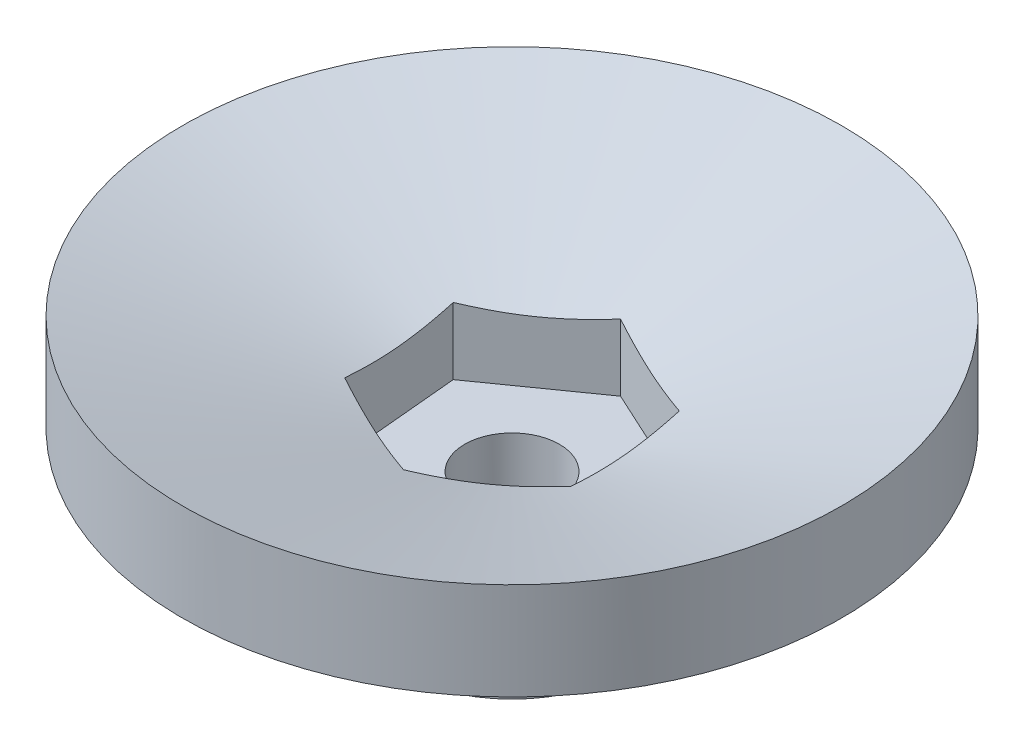
ISO-10303-21;
HEADER;
FILE_DESCRIPTION(('STEP AP214'),'2;1');
FILE_NAME('part.step','',(''),(''),'','','');
FILE_SCHEMA(('AUTOMOTIVE_DESIGN { 1 0 10303 214 1 1 1 1 }'));
ENDSEC;
DATA;
#1=APPLICATION_CONTEXT('core data for automotive mechanical design processes');
#2=APPLICATION_PROTOCOL_DEFINITION('international standard','automotive_design',2000,#1);
#3=PRODUCT_CONTEXT('',#1,'mechanical');
#4=PRODUCT('Part','Part','',(#3));
#5=PRODUCT_RELATED_PRODUCT_CATEGORY('part','',(#4));
#6=PRODUCT_DEFINITION_FORMATION('','',#4);
#7=PRODUCT_DEFINITION_CONTEXT('part definition',#1,'design');
#8=PRODUCT_DEFINITION('design','',#6,#7);
#9=PRODUCT_DEFINITION_SHAPE('','',#8);
#10=(LENGTH_UNIT() NAMED_UNIT(*) SI_UNIT(.MILLI.,.METRE.));
#11=(NAMED_UNIT(*) PLANE_ANGLE_UNIT() SI_UNIT($,.RADIAN.));
#12=(NAMED_UNIT(*) SI_UNIT($,.STERADIAN.) SOLID_ANGLE_UNIT());
#13=UNCERTAINTY_MEASURE_WITH_UNIT(LENGTH_MEASURE(1.E-05),#10,'distance_accuracy_value','');
#14=(GEOMETRIC_REPRESENTATION_CONTEXT(3) GLOBAL_UNCERTAINTY_ASSIGNED_CONTEXT((#13)) GLOBAL_UNIT_ASSIGNED_CONTEXT((#10,
#11,#12)) REPRESENTATION_CONTEXT('',''));
#15=CARTESIAN_POINT('',(0.,0.,0.));
#16=DIRECTION('',(0.,0.,1.));
#17=DIRECTION('',(1.,0.,0.));
#18=AXIS2_PLACEMENT_3D('',#15,#16,#17);
#19=CARTESIAN_POINT('',(0.,17.6822076251545,0.));
#20=DIRECTION('',(0.,1.,0.));
#21=DIRECTION('',(0.,0.,1.));
#22=AXIS2_PLACEMENT_3D('',#19,#20,#21);
#23=CONICAL_SURFACE('',#22,28.5316954888546,1.25663706143592);
#24=CARTESIAN_POINT('',(0.,17.6822076251545,0.));
#25=DIRECTION('',(0.,-1.,0.));
#26=DIRECTION('',(0.,0.,-1.));
#27=AXIS2_PLACEMENT_3D('',#24,#25,#26);
#28=CIRCLE('',#27,28.5316954888546);
#29=CARTESIAN_POINT('',(0.,17.6822076251545,-28.5316954888546));
#30=VERTEX_POINT('',#29);
#31=EDGE_CURVE('E166',#30,#30,#28,.T.);
#32=ORIENTED_EDGE('',*,*,#31,.F.);
#33=EDGE_LOOP('',(#32));
#34=FACE_BOUND('',#33,.T.);
#35=CARTESIAN_POINT('',(9.43870022979649,11.7884021206192,4.34896349665437));
#36=CARTESIAN_POINT('',(9.08684127379955,11.7183683143036,4.59772980691083));
#37=CARTESIAN_POINT('',(8.73405174222567,11.6547172852872,4.84715403946468));
#38=CARTESIAN_POINT('',(8.02664290125282,11.5428019900332,5.34729616804288));
#39=CARTESIAN_POINT('',(7.67202260640352,11.4945471395818,5.59801476078629));
#40=CARTESIAN_POINT('',(6.96409961171872,11.4164337596209,6.09852039900279));
#41=CARTESIAN_POINT('',(6.61080721579867,11.3864389245007,6.34830015954827));
#42=CARTESIAN_POINT('',(5.9035622341988,11.3462124651001,6.84832643860517));
#43=CARTESIAN_POINT('',(5.54960987196697,11.3359750600022,7.09857279913758));
#44=CARTESIAN_POINT('',(4.84170514750331,11.3359750600022,7.59906552020241));
#45=CARTESIAN_POINT('',(4.48775278527148,11.3462124651001,7.84931188073483));
#46=CARTESIAN_POINT('',(3.78050780367161,11.3864389245007,8.34933815979173));
#47=CARTESIAN_POINT('',(3.42721540775155,11.4164337596209,8.5991179203372));
#48=CARTESIAN_POINT('',(2.71929241306675,11.4945471395818,9.0996235585537));
#49=CARTESIAN_POINT('',(2.36467211821745,11.5428019900332,9.35034215129711));
#50=CARTESIAN_POINT('',(1.6572632772446,11.6547172852872,9.85048427987531));
#51=CARTESIAN_POINT('',(1.30447374567073,11.7183683143036,10.0999085124292));
#52=CARTESIAN_POINT('',(0.952614789673784,11.7884021206192,10.3486748226856));
#53=B_SPLINE_CURVE_WITH_KNOTS('',3,(#35,#36,#37,#38,#39,#40,#41,#42,#43,#44,#45,#46,#47,#48,#49,
#50,#51,#52),.UNSPECIFIED.,.F.,.F.,(4,2,2,2,2,2,2,2,4),(0.,1.30981735837269,2.62043422845874,
3.92114377250665,5.221472684806,6.52180159710535,7.82251114115326,9.13312801123931,
10.442945369612),.UNSPECIFIED.);
#54=CARTESIAN_POINT('',(9.43850022979649,11.7883623274375,4.34910489780731));
#55=VERTEX_POINT('',#54);
#56=CARTESIAN_POINT('',(0.952814789673786,11.7883623274375,10.3485334215327));
#57=VERTEX_POINT('',#56);
#58=EDGE_CURVE('E225',#55,#57,#53,.T.);
#59=ORIENTED_EDGE('',*,*,#58,.T.);
#60=CARTESIAN_POINT('',(0.953014789673786,11.7883981034413,10.3486255782269));
#61=CARTESIAN_POINT('',(0.561649218084829,11.7183648772961,10.1682907916834));
#62=CARTESIAN_POINT('',(0.169248591367872,11.6547143940683,9.98747906884534));
#63=CARTESIAN_POINT('',(-0.617587871380383,11.5428000810022,9.62491783235686));
#64=CARTESIAN_POINT('',(-1.01202480348306,11.4945456667279,9.44316781365491));
#65=CARTESIAN_POINT('',(-1.79943314576685,11.41643300162,9.080343064529));
#66=CARTESIAN_POINT('',(-2.19239309530084,11.3864384474423,8.8992736149818));
#67=CARTESIAN_POINT('',(-2.97904730398483,11.3462123669672,8.53679635815367));
#68=CARTESIAN_POINT('',(-3.37274131460464,11.3359750600023,8.35538866539135));
#69=CARTESIAN_POINT('',(-4.16012933584428,11.3359750600023,7.9925732798667));
#70=CARTESIAN_POINT('',(-4.55382334646409,11.3462123669672,7.81116558710438));
#71=CARTESIAN_POINT('',(-5.34047755514808,11.3864384474423,7.44868833027625));
#72=CARTESIAN_POINT('',(-5.73343750468207,11.41643300162,7.26761888072905));
#73=CARTESIAN_POINT('',(-6.52084584696586,11.4945456667279,6.90479413160314));
#74=CARTESIAN_POINT('',(-6.91528277906854,11.5428000810022,6.72304411290119));
#75=CARTESIAN_POINT('',(-7.70211924181679,11.6547143940683,6.36048287641271));
#76=CARTESIAN_POINT('',(-8.09451986853375,11.7183648772961,6.1796711535746));
#77=CARTESIAN_POINT('',(-8.48588544012271,11.7883981034413,5.99933636703115));
#78=B_SPLINE_CURVE_WITH_KNOTS('',3,(#60,#61,#62,#63,#64,#65,#66,#67,#68,#69,#70,#71,#72,#73,#74,
#75,#76,#77),.UNSPECIFIED.,.F.,.F.,(4,2,2,2,2,2,2,2,4),(0.,1.30981104274094,2.62042158020904,
3.92112492117652,5.22144763856673,6.52177035595694,7.82247369692442,9.13308423439252,
10.4428952771335),.UNSPECIFIED.);
#79=CARTESIAN_POINT('',(-8.4856854401227,11.7883623274375,5.99942852372537));
#80=VERTEX_POINT('',#79);
#81=EDGE_CURVE('E11',#57,#80,#78,.T.);
#82=ORIENTED_EDGE('',*,*,#81,.T.);
#83=CARTESIAN_POINT('',(-8.48566702563341,11.7883949573121,5.99962852372537));
#84=CARTESIAN_POINT('',(-8.5251751587772,11.7183621855388,5.57053019245271));
#85=CARTESIAN_POINT('',(-8.56478777974061,11.6547121297561,5.14029701765626));
#86=CARTESIAN_POINT('',(-8.64421847367905,11.5427985859091,4.27759925117965));
#87=CARTESIAN_POINT('',(-8.68403665729989,11.4945445132351,3.84513345777395));
#88=CARTESIAN_POINT('',(-8.76352508190127,11.4164324079777,2.98180867784065));
#89=CARTESIAN_POINT('',(-8.80319416595088,11.3864380738253,2.55096225675432));
#90=CARTESIAN_POINT('',(-8.88260646171251,11.3462122901126,1.68846431310756));
#91=CARTESIAN_POINT('',(-8.92234964833606,11.3359750600023,1.2568130630333));
#92=CARTESIAN_POINT('',(-9.00183602158314,11.3359750600023,0.393510562884759));
#93=CARTESIAN_POINT('',(-9.04157920820669,11.3462122901126,-0.0381406871895081));
#94=CARTESIAN_POINT('',(-9.12099150396832,11.3864380738253,-0.900638630836268));
#95=CARTESIAN_POINT('',(-9.16066058801793,11.4164324079777,-1.33148505192259));
#96=CARTESIAN_POINT('',(-9.24014901261931,11.4945445132351,-2.19480983185589));
#97=CARTESIAN_POINT('',(-9.27996719624015,11.5427985859091,-2.62727562526159));
#98=CARTESIAN_POINT('',(-9.35939789017859,11.6547121297561,-3.48997339173821));
#99=CARTESIAN_POINT('',(-9.399010511142,11.7183621855388,-3.92020656653466));
#100=CARTESIAN_POINT('',(-9.43851864428579,11.7883949573121,-4.34930489780732));
#101=B_SPLINE_CURVE_WITH_KNOTS('',3,(#83,#84,#85,#86,#87,#88,#89,#90,#91,#92,#93,#94,#95,#96,
#97,#98,#99,#100),.UNSPECIFIED.,.F.,.F.,(4,2,2,2,2,2,2,2,4),(0.,1.30980609651888,
2.62041167446202,3.92111015735391,5.22142802306799,6.52174588878206,7.82244437167395,
9.13304994961709,10.442856046136),.UNSPECIFIED.);
#102=CARTESIAN_POINT('',(-9.43850022979649,11.7883623274375,-4.34910489780732));
#103=VERTEX_POINT('',#102);
#104=EDGE_CURVE('E56',#80,#103,#101,.T.);
#105=ORIENTED_EDGE('',*,*,#104,.T.);
#106=CARTESIAN_POINT('',(-9.43870022979649,11.7884021206192,-4.34896349665437));
#107=CARTESIAN_POINT('',(-9.08684127379955,11.7183683143036,-4.59772980691083));
#108=CARTESIAN_POINT('',(-8.73405174222567,11.6547172852872,-4.84715403946469));
#109=CARTESIAN_POINT('',(-8.02664290125283,11.5428019900332,-5.34729616804289));
#110=CARTESIAN_POINT('',(-7.67202260640353,11.4945471395818,-5.59801476078629));
#111=CARTESIAN_POINT('',(-6.96409961171872,11.4164337596209,-6.0985203990028));
#112=CARTESIAN_POINT('',(-6.61080721579867,11.3864389245007,-6.34830015954827));
#113=CARTESIAN_POINT('',(-5.9035622341988,11.3462124651001,-6.84832643860517));
#114=CARTESIAN_POINT('',(-5.54960987196697,11.3359750600023,-7.09857279913758));
#115=CARTESIAN_POINT('',(-4.84170514750331,11.3359750600023,-7.59906552020241));
#116=CARTESIAN_POINT('',(-4.48775278527148,11.3462124651001,-7.84931188073483));
#117=CARTESIAN_POINT('',(-3.78050780367162,11.3864389245007,-8.34933815979173));
#118=CARTESIAN_POINT('',(-3.42721540775156,11.4164337596209,-8.5991179203372));
#119=CARTESIAN_POINT('',(-2.71929241306676,11.4945471395818,-9.0996235585537));
#120=CARTESIAN_POINT('',(-2.36467211821746,11.5428019900332,-9.35034215129711));
#121=CARTESIAN_POINT('',(-1.65726327724461,11.6547172852872,-9.85048427987531));
#122=CARTESIAN_POINT('',(-1.30447374567074,11.7183683143036,-10.0999085124292));
#123=CARTESIAN_POINT('',(-0.952614789673791,11.7884021206192,-10.3486748226856));
#124=B_SPLINE_CURVE_WITH_KNOTS('',3,(#106,#107,#108,#109,#110,#111,#112,#113,#114,#115,#116,
#117,#118,#119,#120,#121,#122,#123),.UNSPECIFIED.,.F.,.F.,(4,2,2,2,2,2,2,2,4),(0.,
1.30981735837269,2.62043422845874,3.92114377250665,5.221472684806,6.52180159710535,
7.82251114115325,9.13312801123931,10.442945369612),.UNSPECIFIED.);
#125=CARTESIAN_POINT('',(-0.952814789673791,11.7883623274375,-10.3485334215327));
#126=VERTEX_POINT('',#125);
#127=EDGE_CURVE('E249',#103,#126,#124,.T.);
#128=ORIENTED_EDGE('',*,*,#127,.T.);
#129=CARTESIAN_POINT('',(-0.953014789673791,11.7883981034413,-10.3486255782269));
#130=CARTESIAN_POINT('',(-0.561649218084835,11.7183648772961,-10.1682907916834));
#131=CARTESIAN_POINT('',(-0.169248591367877,11.6547143940683,-9.98747906884534));
#132=CARTESIAN_POINT('',(0.617587871380377,11.5428000810022,-9.62491783235686));
#133=CARTESIAN_POINT('',(1.01202480348306,11.4945456667279,-9.44316781365491));
#134=CARTESIAN_POINT('',(1.79943314576685,11.41643300162,-9.080343064529));
#135=CARTESIAN_POINT('',(2.19239309530084,11.3864384474423,-8.8992736149818));
#136=CARTESIAN_POINT('',(2.97904730398482,11.3462123669672,-8.53679635815368));
#137=CARTESIAN_POINT('',(3.37274131460464,11.3359750600023,-8.35538866539135));
#138=CARTESIAN_POINT('',(4.16012933584427,11.3359750600023,-7.9925732798667));
#139=CARTESIAN_POINT('',(4.55382334646409,11.3462123669672,-7.81116558710438));
#140=CARTESIAN_POINT('',(5.34047755514807,11.3864384474423,-7.44868833027625));
#141=CARTESIAN_POINT('',(5.73343750468206,11.41643300162,-7.26761888072905));
#142=CARTESIAN_POINT('',(6.52084584696585,11.4945456667279,-6.90479413160314));
#143=CARTESIAN_POINT('',(6.91528277906853,11.5428000810022,-6.72304411290119));
#144=CARTESIAN_POINT('',(7.70211924181679,11.6547143940683,-6.36048287641271));
#145=CARTESIAN_POINT('',(8.09451986853374,11.7183648772961,-6.17967115357461));
#146=CARTESIAN_POINT('',(8.4858854401227,11.7883981034413,-5.99933636703115));
#147=B_SPLINE_CURVE_WITH_KNOTS('',3,(#129,#130,#131,#132,#133,#134,#135,#136,#137,#138,#139,
#140,#141,#142,#143,#144,#145,#146),.UNSPECIFIED.,.F.,.F.,(4,2,2,2,2,2,2,2,4),(0.,
1.30981104274094,2.62042158020904,3.92112492117652,5.22144763856673,6.52177035595694,
7.82247369692442,9.13308423439252,10.4428952771335),.UNSPECIFIED.);
#148=CARTESIAN_POINT('',(8.4856854401227,11.7883623274375,-5.99942852372537));
#149=VERTEX_POINT('',#148);
#150=EDGE_CURVE('E242',#126,#149,#147,.T.);
#151=ORIENTED_EDGE('',*,*,#150,.T.);
#152=CARTESIAN_POINT('',(8.4856670256334,11.7883949573121,-5.99962852372537));
#153=CARTESIAN_POINT('',(8.5251751587772,11.7183621855388,-5.57053019245271));
#154=CARTESIAN_POINT('',(8.56478777974061,11.6547121297561,-5.14029701765627));
#155=CARTESIAN_POINT('',(8.64421847367905,11.5427985859091,-4.27759925117965));
#156=CARTESIAN_POINT('',(8.68403665729988,11.4945445132351,-3.84513345777395));
#157=CARTESIAN_POINT('',(8.76352508190126,11.4164324079777,-2.98180867784065));
#158=CARTESIAN_POINT('',(8.80319416595088,11.3864380738253,-2.55096225675433));
#159=CARTESIAN_POINT('',(8.88260646171251,11.3462122901126,-1.68846431310757));
#160=CARTESIAN_POINT('',(8.92234964833605,11.3359750600022,-1.2568130630333));
#161=CARTESIAN_POINT('',(9.00183602158314,11.3359750600022,-0.393510562884763));
#162=CARTESIAN_POINT('',(9.04157920820668,11.3462122901126,0.0381406871895047));
#163=CARTESIAN_POINT('',(9.12099150396831,11.3864380738253,0.900638630836265));
#164=CARTESIAN_POINT('',(9.16066058801793,11.4164324079777,1.33148505192259));
#165=CARTESIAN_POINT('',(9.24014901261931,11.4945445132351,2.19480983185589));
#166=CARTESIAN_POINT('',(9.27996719624014,11.5427985859091,2.62727562526159));
#167=CARTESIAN_POINT('',(9.35939789017858,11.6547121297561,3.4899733917382));
#168=CARTESIAN_POINT('',(9.39901051114199,11.7183621855388,3.92020656653465));
#169=CARTESIAN_POINT('',(9.43851864428579,11.7883949573121,4.34930489780731));
#170=B_SPLINE_CURVE_WITH_KNOTS('',3,(#152,#153,#154,#155,#156,#157,#158,#159,#160,#161,#162,
#163,#164,#165,#166,#167,#168,#169),.UNSPECIFIED.,.F.,.F.,(4,2,2,2,2,2,2,2,4),(0.,
1.30980609651888,2.62041167446201,3.92111015735391,5.22142802306799,6.52174588878206,
7.82244437167395,9.13304994961709,10.442856046136),.UNSPECIFIED.);
#171=EDGE_CURVE('E234',#149,#55,#170,.T.);
#172=ORIENTED_EDGE('',*,*,#171,.T.);
#173=EDGE_LOOP('',(#59,#82,#105,#128,#151,#172));
#174=FACE_BOUND('',#173,.T.);
#175=ADVANCED_FACE('F41',(#34,#174),#23,.F.);
#176=CARTESIAN_POINT('',(-15.,5.,-28.5316954888546));
#177=DIRECTION('',(0.,1.,0.));
#178=DIRECTION('',(0.,0.,1.));
#179=AXIS2_PLACEMENT_3D('',#176,#177,#178);
#180=PLANE('',#179);
#181=DIRECTION('',(0.,0.,1.));
#182=VECTOR('',#181,1.);
#183=CARTESIAN_POINT('',(15.,5.,-28.5316954888546));
#184=LINE('',#183,#182);
#185=CARTESIAN_POINT('',(15.,5.,-3.43560749722579));
#186=VERTEX_POINT('',#185);
#187=CARTESIAN_POINT('',(15.,5.,0.));
#188=VERTEX_POINT('',#187);
#189=EDGE_CURVE('E168',#186,#188,#184,.T.);
#190=ORIENTED_EDGE('',*,*,#189,.T.);
#191=CARTESIAN_POINT('',(0.,5.,0.));
#192=DIRECTION('',(0.,1.,0.));
#193=DIRECTION('',(0.,0.,1.));
#194=AXIS2_PLACEMENT_3D('',#191,#192,#193);
#195=CIRCLE('',#194,15.);
#196=CARTESIAN_POINT('',(-15.,5.,0.));
#197=VERTEX_POINT('',#196);
#198=EDGE_CURVE('E292',#188,#197,#195,.T.);
#199=ORIENTED_EDGE('',*,*,#198,.T.);
#200=DIRECTION('',(0.,0.,1.));
#201=VECTOR('',#200,1.);
#202=CARTESIAN_POINT('',(-15.,5.,-28.5316954888546));
#203=LINE('',#202,#201);
#204=CARTESIAN_POINT('',(-15.,5.,-3.43560749722581));
#205=VERTEX_POINT('',#204);
#206=EDGE_CURVE('E162',#205,#197,#203,.T.);
#207=ORIENTED_EDGE('',*,*,#206,.F.);
#208=CARTESIAN_POINT('',(0.,5.,0.));
#209=DIRECTION('',(0.,1.,0.));
#210=DIRECTION('',(0.,0.,1.));
#211=AXIS2_PLACEMENT_3D('',#208,#209,#210);
#212=CIRCLE('',#211,15.3884176858764);
#213=EDGE_CURVE('E184',#205,#186,#212,.F.);
#214=ORIENTED_EDGE('',*,*,#213,.T.);
#215=EDGE_LOOP('',(#190,#199,#207,#214));
#216=FACE_BOUND('',#215,.T.);
#217=ADVANCED_FACE('F214',(#216),#180,.F.);
#218=CARTESIAN_POINT('',(0.,0.,0.));
#219=DIRECTION('',(0.,1.,0.));
#220=DIRECTION('',(0.,0.,1.));
#221=AXIS2_PLACEMENT_3D('',#218,#219,#220);
#222=CONICAL_SURFACE('',#221,0.,1.25663706143592);
#223=ORIENTED_EDGE('',*,*,#213,.F.);
#224=CARTESIAN_POINT('',(-15.,28.3053905769127,85.8139222500902));
#225=CARTESIAN_POINT('',(-15.,27.7237719918721,83.9967056989385));
#226=CARTESIAN_POINT('',(-15.,27.1426290691747,82.1793367142862));
#227=CARTESIAN_POINT('',(-15.,25.981551645856,78.544212174026));
#228=CARTESIAN_POINT('',(-15.,25.4016171456126,76.7264566182974));
#229=CARTESIAN_POINT('',(-15.,24.2423758070435,73.0878473709439));
#230=CARTESIAN_POINT('',(-15.,23.6630710916819,71.2669930027856));
#231=CARTESIAN_POINT('',(-15.,22.5062947007004,67.6247019307156));
#232=CARTESIAN_POINT('',(-15.,21.9288230251139,65.8032652267933));
#233=CARTESIAN_POINT('',(-15.,20.7465557983784,62.0659664935322));
#234=CARTESIAN_POINT('',(-15.,20.1418823715771,60.1500658147008));
#235=CARTESIAN_POINT('',(-15.,18.9358772194216,56.3172124909258));
#236=CARTESIAN_POINT('',(-15.,18.3345454939866,54.4002598460077));
#237=CARTESIAN_POINT('',(-15.,17.1372456070341,50.5678104385217));
#238=CARTESIAN_POINT('',(-15.,16.5412707945833,48.6523157556573));
#239=CARTESIAN_POINT('',(-15.,15.3554619717085,44.819422797651));
#240=CARTESIAN_POINT('',(-15.,14.7656279666352,42.9020245208518));
#241=CARTESIAN_POINT('',(-15.,13.6407548830402,39.2154695661836));
#242=CARTESIAN_POINT('',(-15.,13.1050549607589,37.4465150532813));
#243=CARTESIAN_POINT('',(-15.,12.3095837920728,34.7906597933047));
#244=CARTESIAN_POINT('',(-15.,12.0457727603423,33.9049693304255));
#245=CARTESIAN_POINT('',(-15.,11.5214607715062,32.1326080081986));
#246=CARTESIAN_POINT('',(-15.,11.2609598149914,31.245937148676));
#247=CARTESIAN_POINT('',(-15.,10.7428458283352,29.4673236432314));
#248=CARTESIAN_POINT('',(-15.,10.4852516022088,28.5753755130641));
#249=CARTESIAN_POINT('',(-15.,9.97521124778508,26.7900052779691));
#250=CARTESIAN_POINT('',(-15.,9.72276512383929,25.8965831717962));
#251=CARTESIAN_POINT('',(-15.,9.22439483424649,24.107898832274));
#252=CARTESIAN_POINT('',(-15.,8.97847079661168,23.212636563178));
#253=CARTESIAN_POINT('',(-15.,8.49501438089249,21.4198401253087));
#254=CARTESIAN_POINT('',(-15.,8.25748201647039,20.522305952839));
#255=CARTESIAN_POINT('',(-15.,7.80047691513905,18.751944273675));
#256=CARTESIAN_POINT('',(-15.,7.58067382505257,17.8792024017683));
#257=CARTESIAN_POINT('',(-15.,7.15454660426114,16.1304112645318));
#258=CARTESIAN_POINT('',(-15.,6.94822252982746,15.2543619854105));
#259=CARTESIAN_POINT('',(-15.,6.55330568406811,13.4978142329459));
#260=CARTESIAN_POINT('',(-15.,6.36472112354953,12.6173138961602));
#261=CARTESIAN_POINT('',(-15.,6.01120320510191,10.8515063482187));
#262=CARTESIAN_POINT('',(-15.,5.84627042458285,9.96619902025746));
#263=CARTESIAN_POINT('',(-15.,5.54891232077524,8.19856690555233));
#264=CARTESIAN_POINT('',(-15.,5.41619586957994,7.31629236967836));
#265=CARTESIAN_POINT('',(-15.,5.24626954212876,5.98916565853912));
#266=CARTESIAN_POINT('',(-15.,5.19448512478478,5.54616655627218));
#267=CARTESIAN_POINT('',(-15.,5.10165804182766,4.65905151565354));
#268=CARTESIAN_POINT('',(-15.,5.06061491186527,4.21493562641918));
#269=CARTESIAN_POINT('',(-15.,4.99024351816486,3.32647377904734));
#270=CARTESIAN_POINT('',(-15.,4.96089692779351,2.8821292817958));
#271=CARTESIAN_POINT('',(-15.,4.91454995987434,1.99279235843724));
#272=CARTESIAN_POINT('',(-15.,4.89754954916761,1.54779993407361));
#273=CARTESIAN_POINT('',(-15.,4.87634318357737,0.657529557836504));
#274=CARTESIAN_POINT('',(-15.,4.87213660163011,0.212251621026847));
#275=CARTESIAN_POINT('',(-15.,4.87663011566632,-0.678237791488693));
#276=CARTESIAN_POINT('',(-15.,4.88533019004451,-1.12344926730458));
#277=CARTESIAN_POINT('',(-15.,4.91489141840751,-1.99829802372813));
#278=CARTESIAN_POINT('',(-15.,4.93532867859725,-2.42794974741145));
#279=CARTESIAN_POINT('',(-15.,4.98752706366721,-3.28655359696014));
#280=CARTESIAN_POINT('',(-15.,5.01928818768233,-3.71550572287895));
#281=CARTESIAN_POINT('',(-15.,5.13053004139493,-5.001021108576));
#282=CARTESIAN_POINT('',(-15.,5.22596875587945,-5.85622984708187));
#283=CARTESIAN_POINT('',(-15.,5.4523989891689,-7.56332111510819));
#284=CARTESIAN_POINT('',(-15.,5.5834533328384,-8.41519504267326));
#285=CARTESIAN_POINT('',(-15.,5.87352410932606,-10.1140967819412));
#286=CARTESIAN_POINT('',(-15.,6.03254035891224,-10.9611246253626));
#287=CARTESIAN_POINT('',(-15.,6.37377697705436,-12.6592066065271));
#288=CARTESIAN_POINT('',(-15.,6.55621239865508,-13.5102170023822));
#289=CARTESIAN_POINT('',(-15.,6.93778392994434,-15.2084475599233));
#290=CARTESIAN_POINT('',(-15.,7.13691989843803,-16.0556677535898));
#291=CARTESIAN_POINT('',(-15.,7.54777965589934,-17.7463321307357));
#292=CARTESIAN_POINT('',(-15.,7.75949349753224,-18.5897787455154));
#293=CARTESIAN_POINT('',(-15.,8.19272033832641,-20.2741383097389));
#294=CARTESIAN_POINT('',(-15.,8.41423330410466,-21.1150512678038));
#295=CARTESIAN_POINT('',(-15.,8.87200527406262,-22.8213512855453));
#296=CARTESIAN_POINT('',(-15.,9.10850904682762,-23.6866724925059));
#297=CARTESIAN_POINT('',(-15.,9.58786881113969,-25.4155491884242));
#298=CARTESIAN_POINT('',(-15.,9.83072480023193,-26.2791046780641));
#299=CARTESIAN_POINT('',(-15.,10.3215121151784,-28.0049100900413));
#300=CARTESIAN_POINT('',(-15.,10.569444197856,-28.8671597968047));
#301=CARTESIAN_POINT('',(-15.,11.0693568674044,-30.5904827984338));
#302=CARTESIAN_POINT('',(-15.,11.3213374519811,-31.4515560939658));
#303=CARTESIAN_POINT('',(-15.,11.82745685894,-33.1688898262189));
#304=CARTESIAN_POINT('',(-15.,12.0815810229141,-34.0251545868904));
#305=CARTESIAN_POINT('',(-15.,12.5925172932123,-35.7368821710904));
#306=CARTESIAN_POINT('',(-15.,12.8493294025699,-36.5923449937126));
#307=CARTESIAN_POINT('',(-15.,13.6230696492037,-39.1576474547973));
#308=CARTESIAN_POINT('',(-15.,14.1433259856119,-40.8664831253383));
#309=CARTESIAN_POINT('',(-15.,15.2325122115264,-44.4205948763956));
#310=CARTESIAN_POINT('',(-15.,15.8019706669459,-46.2657086329412));
#311=CARTESIAN_POINT('',(-15.,16.946154940919,-49.9543253201702));
#312=CARTESIAN_POINT('',(-15.,17.5208808231837,-51.7978282310737));
#313=CARTESIAN_POINT('',(-15.,18.6750764351395,-55.4863437324936));
#314=CARTESIAN_POINT('',(-15.,19.2545519275843,-57.3313545183681));
#315=CARTESIAN_POINT('',(-15.,20.41646177679,-61.0204366911291));
#316=CARTESIAN_POINT('',(-15.,20.9988961232606,-62.8645080812581));
#317=CARTESIAN_POINT('',(-15.,22.1399168474452,-66.4693228606043));
#318=CARTESIAN_POINT('',(-15.,22.6984026073364,-68.2300981099945));
#319=CARTESIAN_POINT('',(-15.,23.8170503902979,-71.7511181648574));
#320=CARTESIAN_POINT('',(-15.,24.3772124152926,-73.5113629697185));
#321=CARTESIAN_POINT('',(-15.,25.4980772775253,-77.028863901113));
#322=CARTESIAN_POINT('',(-15.,26.0587781471775,-78.7861206547683));
#323=CARTESIAN_POINT('',(-15.,27.1813008685776,-82.3002733272323));
#324=CARTESIAN_POINT('',(-15.,27.7431227187107,-84.0571692465568));
#325=CARTESIAN_POINT('',(-15.,28.3053905769127,-85.8139222500903));
#326=B_SPLINE_CURVE_WITH_KNOTS('',3,(#224,#225,#226,#227,#228,#229,#230,#231,#232,#233,#234,
#235,#236,#237,#238,#239,#240,#241,#242,#243,#244,#245,#246,#247,#248,#249,#250,#251,#252,#253,
#254,#255,#256,#257,#258,#259,#260,#261,#262,#263,#264,#265,#266,#267,#268,#269,#270,#271,#272,
#273,#274,#275,#276,#277,#278,#279,#280,#281,#282,#283,#284,#285,#286,#287,#288,#289,#290,#291,
#292,#293,#294,#295,#296,#297,#298,#299,#300,#301,#302,#303,#304,#305,#306,#307,#308,#309,#310,
#311,#312,#313,#314,#315,#316,#317,#318,#319,#320,#321,#322,#323,#324,#325),.UNSPECIFIED.,.F.,
.F.,(4,2,2,2,2,2,2,2,2,2,2,2,2,2,2,2,2,2,2,2,2,2,2,2,2,2,2,2,2,2,2,2,2,2,2,2,2,2,2,2,2,2,2,2,2,
2,2,2,2,2,4),(0.,5.7240726706258,11.4481471305884,17.1805054809994,22.9128639360585,
28.940029143166,34.9671942046869,40.9853885082381,47.0035880551924,52.5484294735734,
55.3208593175925,58.0932896565078,60.8784770325443,63.6636667626706,66.4489111186953,
69.2341600091012,71.9340658092851,74.6339828801327,77.3351435322918,80.0363701165563,
82.7121931125665,84.0501309611571,85.3880109607151,86.7237863938594,88.0595582394144,
89.3952646137466,90.7309687521567,92.0212212652168,93.3114736797069,95.8920190753424,
98.4771463554855,101.062256696141,103.673077928778,106.283877090438,108.892638274158,
111.501390571207,114.192536864182,116.883682117164,119.575231572981,122.266779503808,
124.946310690051,127.625844900743,132.984656656125,138.777620943814,144.570655391915,
150.372264938358,156.173854321767,161.715524763896,167.257201570542,172.790828450674,
178.324447365051),.UNSPECIFIED.);
#327=CARTESIAN_POINT('',(-15.,5.,3.43560749722581));
#328=VERTEX_POINT('',#327);
#329=EDGE_CURVE('E183',#328,#205,#326,.T.);
#330=ORIENTED_EDGE('',*,*,#329,.F.);
#331=CARTESIAN_POINT('',(15.,5.,3.43560749722579));
#332=VERTEX_POINT('',#331);
#333=EDGE_CURVE('E179',#332,#328,#212,.F.);
#334=ORIENTED_EDGE('',*,*,#333,.F.);
#335=CARTESIAN_POINT('',(15.,28.3053905769127,-85.8139222500902));
#336=CARTESIAN_POINT('',(15.,27.7237719918721,-83.9967056989385));
#337=CARTESIAN_POINT('',(15.,27.1426290691747,-82.1793367142862));
#338=CARTESIAN_POINT('',(15.,25.981551645856,-78.544212174026));
#339=CARTESIAN_POINT('',(15.,25.4016171456126,-76.7264566182974));
#340=CARTESIAN_POINT('',(15.,24.2423758070435,-73.0878473709439));
#341=CARTESIAN_POINT('',(15.,23.6630710916819,-71.2669930027856));
#342=CARTESIAN_POINT('',(15.,22.5062947007004,-67.6247019307156));
#343=CARTESIAN_POINT('',(15.,21.9288230251139,-65.8032652267933));
#344=CARTESIAN_POINT('',(15.,20.7465557983784,-62.0659664935322));
#345=CARTESIAN_POINT('',(15.,20.1418823715771,-60.1500658147008));
#346=CARTESIAN_POINT('',(15.,18.9358772194216,-56.3172124909258));
#347=CARTESIAN_POINT('',(15.,18.3345454939866,-54.4002598460077));
#348=CARTESIAN_POINT('',(15.,17.1372456070341,-50.5678104385217));
#349=CARTESIAN_POINT('',(15.,16.5412707945833,-48.6523157556573));
#350=CARTESIAN_POINT('',(15.,15.3554619717085,-44.819422797651));
#351=CARTESIAN_POINT('',(15.,14.7656279666352,-42.9020245208518));
#352=CARTESIAN_POINT('',(15.,13.6407548830402,-39.2154695661836));
#353=CARTESIAN_POINT('',(15.,13.1050549607589,-37.4465150532813));
#354=CARTESIAN_POINT('',(15.,12.3095837920728,-34.7906597933047));
#355=CARTESIAN_POINT('',(15.,12.0457727603423,-33.9049693304255));
#356=CARTESIAN_POINT('',(15.,11.5214607715062,-32.1326080081986));
#357=CARTESIAN_POINT('',(15.,11.2609598149914,-31.245937148676));
#358=CARTESIAN_POINT('',(15.,10.7428458283352,-29.4673236432314));
#359=CARTESIAN_POINT('',(15.,10.4852516022088,-28.5753755130641));
#360=CARTESIAN_POINT('',(15.,9.97521124778508,-26.7900052779691));
#361=CARTESIAN_POINT('',(15.,9.72276512383929,-25.8965831717962));
#362=CARTESIAN_POINT('',(15.,9.22439483424649,-24.107898832274));
#363=CARTESIAN_POINT('',(15.,8.97847079661168,-23.212636563178));
#364=CARTESIAN_POINT('',(15.,8.49501438089249,-21.4198401253087));
#365=CARTESIAN_POINT('',(15.,8.25748201647039,-20.522305952839));
#366=CARTESIAN_POINT('',(15.,7.80047691513905,-18.751944273675));
#367=CARTESIAN_POINT('',(15.,7.58067382505257,-17.8792024017683));
#368=CARTESIAN_POINT('',(15.,7.15454660426114,-16.1304112645318));
#369=CARTESIAN_POINT('',(15.,6.94822252982747,-15.2543619854105));
#370=CARTESIAN_POINT('',(15.,6.55330568406812,-13.4978142329459));
#371=CARTESIAN_POINT('',(15.,6.36472112354953,-12.6173138961602));
#372=CARTESIAN_POINT('',(15.,6.01120320510191,-10.8515063482187));
#373=CARTESIAN_POINT('',(15.,5.84627042458285,-9.96619902025745));
#374=CARTESIAN_POINT('',(15.,5.54891232077524,-8.19856690555233));
#375=CARTESIAN_POINT('',(15.,5.41619586957994,-7.31629236967836));
#376=CARTESIAN_POINT('',(15.,5.24626954212876,-5.98916565853912));
#377=CARTESIAN_POINT('',(15.,5.19448512478478,-5.54616655627218));
#378=CARTESIAN_POINT('',(15.,5.10165804182766,-4.65905151565354));
#379=CARTESIAN_POINT('',(15.,5.06061491186527,-4.21493562641918));
#380=CARTESIAN_POINT('',(15.,4.99024351816486,-3.32647377904734));
#381=CARTESIAN_POINT('',(15.,4.96089692779351,-2.8821292817958));
#382=CARTESIAN_POINT('',(15.,4.91454995987434,-1.99279235843724));
#383=CARTESIAN_POINT('',(15.,4.89754954916761,-1.5477999340736));
#384=CARTESIAN_POINT('',(15.,4.87634318357737,-0.657529557836497));
#385=CARTESIAN_POINT('',(15.,4.87213660163011,-0.212251621026836));
#386=CARTESIAN_POINT('',(15.,4.87663011566633,0.678237791488704));
#387=CARTESIAN_POINT('',(15.,4.88533019004452,1.12344926730459));
#388=CARTESIAN_POINT('',(15.,4.91489141840751,1.99829802372813));
#389=CARTESIAN_POINT('',(15.,4.93532867859725,2.42794974741145));
#390=CARTESIAN_POINT('',(15.,4.98752706366721,3.28655359696014));
#391=CARTESIAN_POINT('',(15.,5.01928818768233,3.71550572287895));
#392=CARTESIAN_POINT('',(15.,5.13053004139493,5.001021108576));
#393=CARTESIAN_POINT('',(15.,5.22596875587945,5.85622984708187));
#394=CARTESIAN_POINT('',(15.,5.4523989891689,7.56332111510819));
#395=CARTESIAN_POINT('',(15.,5.5834533328384,8.41519504267326));
#396=CARTESIAN_POINT('',(15.,5.87352410932606,10.1140967819412));
#397=CARTESIAN_POINT('',(15.,6.03254035891224,10.9611246253626));
#398=CARTESIAN_POINT('',(15.,6.37377697705437,12.6592066065271));
#399=CARTESIAN_POINT('',(15.,6.55621239865508,13.5102170023822));
#400=CARTESIAN_POINT('',(15.,6.93778392994434,15.2084475599233));
#401=CARTESIAN_POINT('',(15.,7.13691989843803,16.0556677535898));
#402=CARTESIAN_POINT('',(15.,7.54777965589934,17.7463321307357));
#403=CARTESIAN_POINT('',(15.,7.75949349753224,18.5897787455154));
#404=CARTESIAN_POINT('',(15.,8.19272033832641,20.2741383097389));
#405=CARTESIAN_POINT('',(15.,8.41423330410466,21.1150512678038));
#406=CARTESIAN_POINT('',(15.,8.87200527406262,22.8213512855453));
#407=CARTESIAN_POINT('',(15.,9.10850904682762,23.6866724925059));
#408=CARTESIAN_POINT('',(15.,9.5878688111397,25.4155491884242));
#409=CARTESIAN_POINT('',(15.,9.83072480023192,26.2791046780641));
#410=CARTESIAN_POINT('',(15.,10.3215121151784,28.0049100900413));
#411=CARTESIAN_POINT('',(15.,10.569444197856,28.8671597968047));
#412=CARTESIAN_POINT('',(15.,11.0693568674044,30.5904827984338));
#413=CARTESIAN_POINT('',(15.,11.3213374519811,31.4515560939658));
#414=CARTESIAN_POINT('',(15.,11.82745685894,33.1688898262189));
#415=CARTESIAN_POINT('',(15.,12.0815810229141,34.0251545868904));
#416=CARTESIAN_POINT('',(15.,12.5925172932123,35.7368821710904));
#417=CARTESIAN_POINT('',(15.,12.8493294025699,36.5923449937126));
#418=CARTESIAN_POINT('',(15.,13.6230696492037,39.1576474547973));
#419=CARTESIAN_POINT('',(15.,14.1433259856119,40.8664831253383));
#420=CARTESIAN_POINT('',(15.,15.2325122115264,44.4205948763956));
#421=CARTESIAN_POINT('',(15.,15.8019706669459,46.2657086329412));
#422=CARTESIAN_POINT('',(15.,16.946154940919,49.9543253201702));
#423=CARTESIAN_POINT('',(15.,17.5208808231837,51.7978282310737));
#424=CARTESIAN_POINT('',(15.,18.6750764351395,55.4863437324936));
#425=CARTESIAN_POINT('',(15.,19.2545519275843,57.3313545183681));
#426=CARTESIAN_POINT('',(15.,20.41646177679,61.0204366911291));
#427=CARTESIAN_POINT('',(15.,20.9988961232606,62.8645080812581));
#428=CARTESIAN_POINT('',(15.,22.1399168474452,66.4693228606043));
#429=CARTESIAN_POINT('',(15.,22.6984026073364,68.2300981099945));
#430=CARTESIAN_POINT('',(15.,23.8170503902979,71.7511181648574));
#431=CARTESIAN_POINT('',(15.,24.3772124152926,73.5113629697185));
#432=CARTESIAN_POINT('',(15.,25.4980772775253,77.028863901113));
#433=CARTESIAN_POINT('',(15.,26.0587781471775,78.7861206547683));
#434=CARTESIAN_POINT('',(15.,27.1813008685776,82.3002733272323));
#435=CARTESIAN_POINT('',(15.,27.7431227187107,84.0571692465568));
#436=CARTESIAN_POINT('',(15.,28.3053905769127,85.8139222500903));
#437=B_SPLINE_CURVE_WITH_KNOTS('',3,(#335,#336,#337,#338,#339,#340,#341,#342,#343,#344,#345,
#346,#347,#348,#349,#350,#351,#352,#353,#354,#355,#356,#357,#358,#359,#360,#361,#362,#363,#364,
#365,#366,#367,#368,#369,#370,#371,#372,#373,#374,#375,#376,#377,#378,#379,#380,#381,#382,#383,
#384,#385,#386,#387,#388,#389,#390,#391,#392,#393,#394,#395,#396,#397,#398,#399,#400,#401,#402,
#403,#404,#405,#406,#407,#408,#409,#410,#411,#412,#413,#414,#415,#416,#417,#418,#419,#420,#421,
#422,#423,#424,#425,#426,#427,#428,#429,#430,#431,#432,#433,#434,#435,#436),.UNSPECIFIED.,.F.,
.F.,(4,2,2,2,2,2,2,2,2,2,2,2,2,2,2,2,2,2,2,2,2,2,2,2,2,2,2,2,2,2,2,2,2,2,2,2,2,2,2,2,2,2,2,2,2,
2,2,2,2,2,4),(0.,5.7240726706258,11.4481471305884,17.1805054809994,22.9128639360585,
28.940029143166,34.9671942046869,40.9853885082381,47.0035880551924,52.5484294735734,
55.3208593175925,58.0932896565078,60.8784770325443,63.6636667626706,66.4489111186953,
69.2341600091012,71.9340658092851,74.6339828801327,77.3351435322918,80.0363701165563,
82.7121931125665,84.0501309611571,85.3880109607151,86.7237863938594,88.0595582394144,
89.3952646137466,90.7309687521567,92.0212212652168,93.3114736797069,95.8920190753425,
98.4771463554856,101.062256696141,103.673077928778,106.283877090438,108.892638274158,
111.501390571207,114.192536864182,116.883682117164,119.575231572981,122.266779503808,
124.946310690051,127.625844900743,132.984656656125,138.777620943814,144.570655391915,
150.372264938358,156.173854321767,161.715524763896,167.257201570542,172.790828450674,
178.324447365051),.UNSPECIFIED.);
#438=EDGE_CURVE('E192',#186,#332,#437,.T.);
#439=ORIENTED_EDGE('',*,*,#438,.F.);
#440=EDGE_LOOP('',(#223,#330,#334,#439));
#441=FACE_BOUND('',#440,.T.);
#442=CARTESIAN_POINT('',(0.,9.27050983124834,0.));
#443=DIRECTION('',(0.,-1.,0.));
#444=DIRECTION('',(0.,0.,-1.));
#445=AXIS2_PLACEMENT_3D('',#442,#443,#444);
#446=CIRCLE('',#445,28.5316954888546);
#447=CARTESIAN_POINT('',(0.,9.27050983124834,-28.5316954888546));
#448=VERTEX_POINT('',#447);
#449=EDGE_CURVE('E175',#448,#448,#446,.T.);
#450=ORIENTED_EDGE('',*,*,#449,.T.);
#451=EDGE_LOOP('',(#450));
#452=FACE_BOUND('',#451,.T.);
#453=ADVANCED_FACE('F199',(#441,#452),#222,.T.);
#454=CARTESIAN_POINT('',(0.,0.,0.));
#455=DIRECTION('',(0.,-1.,0.));
#456=DIRECTION('',(0.,0.,-1.));
#457=AXIS2_PLACEMENT_3D('',#454,#455,#456);
#458=CYLINDRICAL_SURFACE('',#457,28.5316954888546);
#459=ORIENTED_EDGE('',*,*,#31,.T.);
#460=EDGE_LOOP('',(#459));
#461=FACE_BOUND('',#460,.T.);
#462=ORIENTED_EDGE('',*,*,#449,.F.);
#463=EDGE_LOOP('',(#462));
#464=FACE_BOUND('',#463,.T.);
#465=ADVANCED_FACE('F217',(#461,#464),#458,.T.);
#466=CARTESIAN_POINT('',(15.,5.,-28.5316954888546));
#467=DIRECTION('',(1.,0.,0.));
#468=DIRECTION('',(0.,0.,-1.));
#469=AXIS2_PLACEMENT_3D('',#466,#467,#468);
#470=PLANE('',#469);
#471=ORIENTED_EDGE('',*,*,#438,.T.);
#472=EDGE_CURVE('E161',#188,#332,#184,.T.);
#473=ORIENTED_EDGE('',*,*,#472,.F.);
#474=ORIENTED_EDGE('',*,*,#189,.F.);
#475=EDGE_LOOP('',(#471,#473,#474));
#476=FACE_BOUND('',#475,.T.);
#477=ADVANCED_FACE('F208',(#476),#470,.F.);
#478=CARTESIAN_POINT('',(-15.,5.,-28.5316954888546));
#479=DIRECTION('',(-1.,0.,0.));
#480=DIRECTION('',(0.,-1.,0.));
#481=AXIS2_PLACEMENT_3D('',#478,#479,#480);
#482=PLANE('',#481);
#483=ORIENTED_EDGE('',*,*,#329,.T.);
#484=ORIENTED_EDGE('',*,*,#206,.T.);
#485=EDGE_CURVE('E167',#197,#328,#203,.T.);
#486=ORIENTED_EDGE('',*,*,#485,.T.);
#487=EDGE_LOOP('',(#483,#484,#486));
#488=FACE_BOUND('',#487,.T.);
#489=ADVANCED_FACE('F202',(#488),#482,.F.);
#490=ORIENTED_EDGE('',*,*,#485,.F.);
#491=CARTESIAN_POINT('',(0.,5.,0.));
#492=DIRECTION('',(0.,1.,0.));
#493=DIRECTION('',(0.,0.,1.));
#494=AXIS2_PLACEMENT_3D('',#491,#492,#493);
#495=CIRCLE('',#494,15.);
#496=EDGE_CURVE('E70',#197,#188,#495,.T.);
#497=ORIENTED_EDGE('',*,*,#496,.T.);
#498=ORIENTED_EDGE('',*,*,#472,.T.);
#499=ORIENTED_EDGE('',*,*,#333,.T.);
#500=EDGE_LOOP('',(#490,#497,#498,#499));
#501=FACE_BOUND('',#500,.T.);
#502=ADVANCED_FACE('F207',(#501),#180,.F.);
#503=CARTESIAN_POINT('',(0.,-4.,0.));
#504=DIRECTION('',(0.,1.,0.));
#505=DIRECTION('',(0.,0.,1.));
#506=AXIS2_PLACEMENT_3D('',#503,#504,#505);
#507=CYLINDRICAL_SURFACE('',#506,10.);
#508=CARTESIAN_POINT('',(0.,0.,0.));
#509=DIRECTION('',(0.,1.,0.));
#510=DIRECTION('',(0.,0.,1.));
#511=AXIS2_PLACEMENT_3D('',#508,#509,#510);
#512=CIRCLE('',#511,10.);
#513=CARTESIAN_POINT('',(0.,0.,10.));
#514=VERTEX_POINT('',#513);
#515=EDGE_CURVE('E287',#514,#514,#512,.F.);
#516=ORIENTED_EDGE('',*,*,#515,.T.);
#517=EDGE_LOOP('',(#516));
#518=FACE_BOUND('',#517,.T.);
#519=CARTESIAN_POINT('',(0.,-4.,0.));
#520=DIRECTION('',(0.,-1.,0.));
#521=DIRECTION('',(0.,0.,-1.));
#522=AXIS2_PLACEMENT_3D('',#519,#520,#521);
#523=CIRCLE('',#522,10.);
#524=CARTESIAN_POINT('',(0.,-4.,-10.));
#525=VERTEX_POINT('',#524);
#526=EDGE_CURVE('E157',#525,#525,#523,.T.);
#527=ORIENTED_EDGE('',*,*,#526,.F.);
#528=EDGE_LOOP('',(#527));
#529=FACE_BOUND('',#528,.T.);
#530=ADVANCED_FACE('F210',(#518,#529),#507,.T.);
#531=CARTESIAN_POINT('',(0.,-4.,0.));
#532=DIRECTION('',(0.,-1.,0.));
#533=DIRECTION('',(0.,0.,-1.));
#534=AXIS2_PLACEMENT_3D('',#531,#532,#533);
#535=PLANE('',#534);
#536=CARTESIAN_POINT('',(0.,-4.,0.));
#537=DIRECTION('',(0.,1.,0.));
#538=DIRECTION('',(0.,0.,1.));
#539=AXIS2_PLACEMENT_3D('',#536,#537,#538);
#540=CIRCLE('',#539,4.1);
#541=CARTESIAN_POINT('',(0.,-4.,4.1));
#542=VERTEX_POINT('',#541);
#543=EDGE_CURVE('E148',#542,#542,#540,.T.);
#544=ORIENTED_EDGE('',*,*,#543,.T.);
#545=EDGE_LOOP('',(#544));
#546=FACE_BOUND('',#545,.T.);
#547=ORIENTED_EDGE('',*,*,#526,.T.);
#548=EDGE_LOOP('',(#547));
#549=FACE_BOUND('',#548,.T.);
#550=ADVANCED_FACE('F270',(#546,#549),#535,.T.);
#551=CARTESIAN_POINT('',(0.,-4.,0.));
#552=DIRECTION('',(0.,1.,0.));
#553=DIRECTION('',(0.,0.,1.));
#554=AXIS2_PLACEMENT_3D('',#551,#552,#553);
#555=CYLINDRICAL_SURFACE('',#554,4.1);
#556=CARTESIAN_POINT('',(0.,6.,0.));
#557=DIRECTION('',(0.,-1.,0.));
#558=DIRECTION('',(0.,0.,-1.));
#559=AXIS2_PLACEMENT_3D('',#556,#557,#558);
#560=CIRCLE('',#559,4.1);
#561=CARTESIAN_POINT('',(0.,6.,-4.1));
#562=VERTEX_POINT('',#561);
#563=EDGE_CURVE('E142',#562,#562,#560,.F.);
#564=ORIENTED_EDGE('',*,*,#563,.T.);
#565=EDGE_LOOP('',(#564));
#566=FACE_BOUND('',#565,.T.);
#567=ORIENTED_EDGE('',*,*,#543,.F.);
#568=EDGE_LOOP('',(#567));
#569=FACE_BOUND('',#568,.T.);
#570=ADVANCED_FACE('F268',(#566,#569),#555,.F.);
#571=CARTESIAN_POINT('',(0.,0.,0.));
#572=DIRECTION('',(0.,1.,0.));
#573=DIRECTION('',(0.,0.,1.));
#574=AXIS2_PLACEMENT_3D('',#571,#572,#573);
#575=TOROIDAL_SURFACE('',#574,15.,5.);
#576=ORIENTED_EDGE('',*,*,#496,.F.);
#577=ORIENTED_EDGE('',*,*,#198,.F.);
#578=EDGE_LOOP('',(#576,#577));
#579=FACE_BOUND('',#578,.T.);
#580=ORIENTED_EDGE('',*,*,#515,.F.);
#581=EDGE_LOOP('',(#580));
#582=FACE_BOUND('',#581,.T.);
#583=ADVANCED_FACE('F43',(#579,#582),#575,.F.);
#584=CARTESIAN_POINT('',(0.,6.,0.));
#585=DIRECTION('',(0.,-1.,0.));
#586=DIRECTION('',(0.,0.,-1.));
#587=AXIS2_PLACEMENT_3D('',#584,#585,#586);
#588=PLANE('',#587);
#589=DIRECTION('',(-0.908220108069892,0.,-0.418492813913828));
#590=VECTOR('',#589,1.);
#591=CARTESIAN_POINT('',(0.952814789673786,6.,10.3485334215327));
#592=LINE('',#591,#590);
#593=CARTESIAN_POINT('',(0.952814789673786,6.,10.3485334215327));
#594=VERTEX_POINT('',#593);
#595=CARTESIAN_POINT('',(-8.4856854401227,6.,5.99942852372537));
#596=VERTEX_POINT('',#595);
#597=EDGE_CURVE('E124',#594,#596,#592,.T.);
#598=ORIENTED_EDGE('',*,*,#597,.F.);
#599=DIRECTION('',(-0.816535462185555,0.,0.57729527885946));
#600=VECTOR('',#599,1.);
#601=CARTESIAN_POINT('',(9.43850022979649,6.,4.34910489780731));
#602=LINE('',#601,#600);
#603=CARTESIAN_POINT('',(9.43850022979649,6.,4.34910489780731));
#604=VERTEX_POINT('',#603);
#605=EDGE_CURVE('E324',#604,#594,#602,.T.);
#606=ORIENTED_EDGE('',*,*,#605,.F.);
#607=DIRECTION('',(0.0916846458843366,0.,0.995788092773289));
#608=VECTOR('',#607,1.);
#609=CARTESIAN_POINT('',(8.4856854401227,6.,-5.99942852372537));
#610=LINE('',#609,#608);
#611=CARTESIAN_POINT('',(8.4856854401227,6.,-5.99942852372537));
#612=VERTEX_POINT('',#611);
#613=EDGE_CURVE('E327',#612,#604,#610,.T.);
#614=ORIENTED_EDGE('',*,*,#613,.F.);
#615=DIRECTION('',(0.908220108069892,0.,0.418492813913828));
#616=VECTOR('',#615,1.);
#617=CARTESIAN_POINT('',(-0.952814789673791,6.,-10.3485334215327));
#618=LINE('',#617,#616);
#619=CARTESIAN_POINT('',(-0.952814789673791,6.,-10.3485334215327));
#620=VERTEX_POINT('',#619);
#621=EDGE_CURVE('E330',#620,#612,#618,.T.);
#622=ORIENTED_EDGE('',*,*,#621,.F.);
#623=DIRECTION('',(0.816535462185555,0.,-0.57729527885946));
#624=VECTOR('',#623,1.);
#625=CARTESIAN_POINT('',(-9.43850022979649,6.,-4.34910489780732));
#626=LINE('',#625,#624);
#627=CARTESIAN_POINT('',(-9.43850022979649,6.,-4.34910489780732));
#628=VERTEX_POINT('',#627);
#629=EDGE_CURVE('E126',#628,#620,#626,.T.);
#630=ORIENTED_EDGE('',*,*,#629,.F.);
#631=DIRECTION('',(-0.0916846458843363,0.,-0.995788092773289));
#632=VECTOR('',#631,1.);
#633=CARTESIAN_POINT('',(-8.4856854401227,6.,5.99942852372537));
#634=LINE('',#633,#632);
#635=EDGE_CURVE('E119',#596,#628,#634,.T.);
#636=ORIENTED_EDGE('',*,*,#635,.F.);
#637=EDGE_LOOP('',(#598,#606,#614,#622,#630,#636));
#638=FACE_BOUND('',#637,.T.);
#639=ORIENTED_EDGE('',*,*,#563,.F.);
#640=EDGE_LOOP('',(#639));
#641=FACE_BOUND('',#640,.T.);
#642=ADVANCED_FACE('F121',(#638,#641),#588,.F.);
#643=CARTESIAN_POINT('',(0.952814789673786,6.,10.3485334215327));
#644=DIRECTION('',(0.418492813913829,0.,-0.908220108069892));
#645=DIRECTION('',(-0.908220108069892,0.,-0.418492813913828));
#646=AXIS2_PLACEMENT_3D('',#643,#644,#645);
#647=PLANE('',#646);
#648=DIRECTION('',(0.,1.,0.));
#649=VECTOR('',#648,1.);
#650=CARTESIAN_POINT('',(0.952814789673786,6.,10.3485334215327));
#651=LINE('',#650,#649);
#652=EDGE_CURVE('E63',#594,#57,#651,.T.);
#653=ORIENTED_EDGE('',*,*,#652,.F.);
#654=ORIENTED_EDGE('',*,*,#597,.T.);
#655=DIRECTION('',(0.,1.,0.));
#656=VECTOR('',#655,1.);
#657=CARTESIAN_POINT('',(-8.4856854401227,6.,5.99942852372537));
#658=LINE('',#657,#656);
#659=EDGE_CURVE('E136',#596,#80,#658,.T.);
#660=ORIENTED_EDGE('',*,*,#659,.T.);
#661=ORIENTED_EDGE('',*,*,#81,.F.);
#662=EDGE_LOOP('',(#653,#654,#660,#661));
#663=FACE_BOUND('',#662,.T.);
#664=ADVANCED_FACE('F135',(#663),#647,.T.);
#665=CARTESIAN_POINT('',(-8.4856854401227,6.,5.99942852372537));
#666=DIRECTION('',(0.995788092773289,0.,-0.0916846458843363));
#667=DIRECTION('',(-0.0916846458843363,0.,-0.995788092773289));
#668=AXIS2_PLACEMENT_3D('',#665,#666,#667);
#669=PLANE('',#668);
#670=ORIENTED_EDGE('',*,*,#659,.F.);
#671=ORIENTED_EDGE('',*,*,#635,.T.);
#672=DIRECTION('',(0.,1.,0.));
#673=VECTOR('',#672,1.);
#674=CARTESIAN_POINT('',(-9.43850022979649,6.,-4.34910489780732));
#675=LINE('',#674,#673);
#676=EDGE_CURVE('E143',#628,#103,#675,.T.);
#677=ORIENTED_EDGE('',*,*,#676,.T.);
#678=ORIENTED_EDGE('',*,*,#104,.F.);
#679=EDGE_LOOP('',(#670,#671,#677,#678));
#680=FACE_BOUND('',#679,.T.);
#681=ADVANCED_FACE('F139',(#680),#669,.T.);
#682=CARTESIAN_POINT('',(-9.43850022979649,6.,-4.34910489780732));
#683=DIRECTION('',(0.57729527885946,0.,0.816535462185555));
#684=DIRECTION('',(0.816535462185555,0.,-0.57729527885946));
#685=AXIS2_PLACEMENT_3D('',#682,#683,#684);
#686=PLANE('',#685);
#687=ORIENTED_EDGE('',*,*,#676,.F.);
#688=ORIENTED_EDGE('',*,*,#629,.T.);
#689=DIRECTION('',(0.,1.,0.));
#690=VECTOR('',#689,1.);
#691=CARTESIAN_POINT('',(-0.952814789673791,6.,-10.3485334215327));
#692=LINE('',#691,#690);
#693=EDGE_CURVE('E150',#620,#126,#692,.T.);
#694=ORIENTED_EDGE('',*,*,#693,.T.);
#695=ORIENTED_EDGE('',*,*,#127,.F.);
#696=EDGE_LOOP('',(#687,#688,#694,#695));
#697=FACE_BOUND('',#696,.T.);
#698=ADVANCED_FACE('F263',(#697),#686,.T.);
#699=CARTESIAN_POINT('',(-0.952814789673791,6.,-10.3485334215327));
#700=DIRECTION('',(-0.418492813913828,0.,0.908220108069892));
#701=DIRECTION('',(0.908220108069892,0.,0.418492813913829));
#702=AXIS2_PLACEMENT_3D('',#699,#700,#701);
#703=PLANE('',#702);
#704=ORIENTED_EDGE('',*,*,#693,.F.);
#705=ORIENTED_EDGE('',*,*,#621,.T.);
#706=DIRECTION('',(0.,1.,0.));
#707=VECTOR('',#706,1.);
#708=CARTESIAN_POINT('',(8.4856854401227,6.,-5.99942852372537));
#709=LINE('',#708,#707);
#710=EDGE_CURVE('E313',#612,#149,#709,.T.);
#711=ORIENTED_EDGE('',*,*,#710,.T.);
#712=ORIENTED_EDGE('',*,*,#150,.F.);
#713=EDGE_LOOP('',(#704,#705,#711,#712));
#714=FACE_BOUND('',#713,.T.);
#715=ADVANCED_FACE('F335',(#714),#703,.T.);
#716=CARTESIAN_POINT('',(8.4856854401227,6.,-5.99942852372537));
#717=DIRECTION('',(-0.995788092773289,0.,0.0916846458843366));
#718=DIRECTION('',(0.0916846458843366,0.,0.995788092773289));
#719=AXIS2_PLACEMENT_3D('',#716,#717,#718);
#720=PLANE('',#719);
#721=ORIENTED_EDGE('',*,*,#710,.F.);
#722=ORIENTED_EDGE('',*,*,#613,.T.);
#723=DIRECTION('',(0.,1.,0.));
#724=VECTOR('',#723,1.);
#725=CARTESIAN_POINT('',(9.43850022979649,6.,4.34910489780731));
#726=LINE('',#725,#724);
#727=EDGE_CURVE('E316',#604,#55,#726,.T.);
#728=ORIENTED_EDGE('',*,*,#727,.T.);
#729=ORIENTED_EDGE('',*,*,#171,.F.);
#730=EDGE_LOOP('',(#721,#722,#728,#729));
#731=FACE_BOUND('',#730,.T.);
#732=ADVANCED_FACE('F338',(#731),#720,.T.);
#733=CARTESIAN_POINT('',(9.43850022979649,6.,4.34910489780731));
#734=DIRECTION('',(-0.57729527885946,0.,-0.816535462185555));
#735=DIRECTION('',(-0.816535462185555,0.,0.57729527885946));
#736=AXIS2_PLACEMENT_3D('',#733,#734,#735);
#737=PLANE('',#736);
#738=ORIENTED_EDGE('',*,*,#727,.F.);
#739=ORIENTED_EDGE('',*,*,#605,.T.);
#740=ORIENTED_EDGE('',*,*,#652,.T.);
#741=ORIENTED_EDGE('',*,*,#58,.F.);
#742=EDGE_LOOP('',(#738,#739,#740,#741));
#743=FACE_BOUND('',#742,.T.);
#744=ADVANCED_FACE('F340',(#743),#737,.T.);
#745=CLOSED_SHELL('',(#175,#217,#453,#465,#477,#489,#502,#530,#550,#570,#583,#642,#664,#681,
#698,#715,#732,#744));
#746=MANIFOLD_SOLID_BREP('B2',#745);
#747=ADVANCED_BREP_SHAPE_REPRESENTATION('',(#18,#746),#14);
#748=SHAPE_DEFINITION_REPRESENTATION(#9,#747);
ENDSEC;
END-ISO-10303-21;
